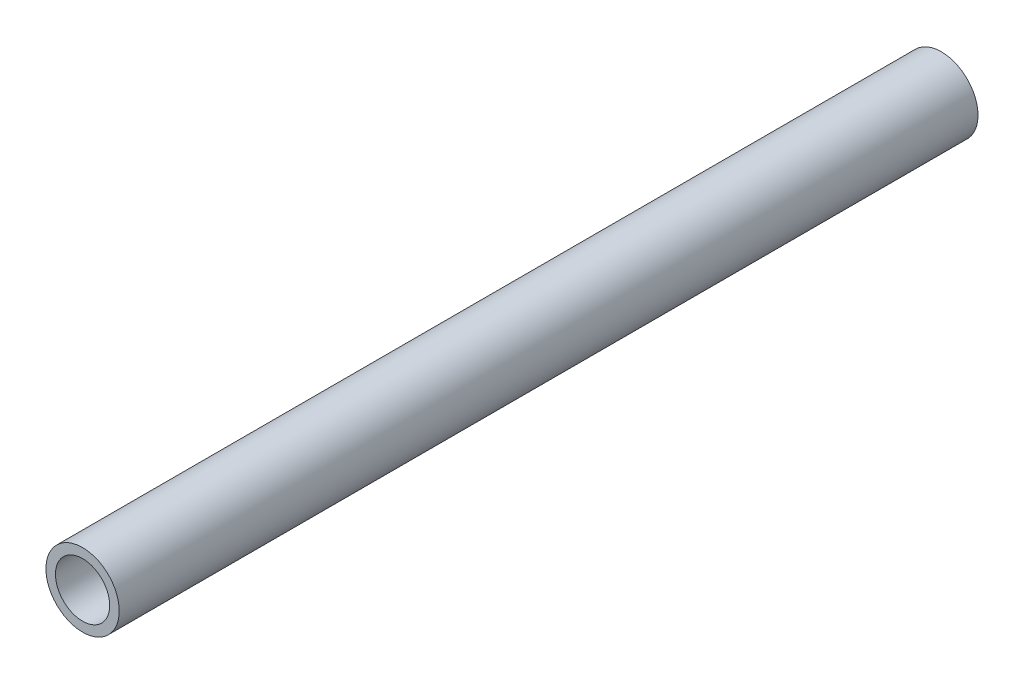
ISO-10303-21;
HEADER;
FILE_DESCRIPTION(('STEP AP214'),'2;1');
FILE_NAME('part.step','',(''),(''),'','','');
FILE_SCHEMA(('AUTOMOTIVE_DESIGN { 1 0 10303 214 1 1 1 1 }'));
ENDSEC;
DATA;
#1=APPLICATION_CONTEXT('core data for automotive mechanical design processes');
#2=APPLICATION_PROTOCOL_DEFINITION('international standard','automotive_design',2000,#1);
#3=PRODUCT_CONTEXT('',#1,'mechanical');
#4=PRODUCT('Part','Part','',(#3));
#5=PRODUCT_RELATED_PRODUCT_CATEGORY('part','',(#4));
#6=PRODUCT_DEFINITION_FORMATION('','',#4);
#7=PRODUCT_DEFINITION_CONTEXT('part definition',#1,'design');
#8=PRODUCT_DEFINITION('design','',#6,#7);
#9=PRODUCT_DEFINITION_SHAPE('','',#8);
#10=(LENGTH_UNIT() NAMED_UNIT(*) SI_UNIT(.MILLI.,.METRE.));
#11=(NAMED_UNIT(*) PLANE_ANGLE_UNIT() SI_UNIT($,.RADIAN.));
#12=(NAMED_UNIT(*) SI_UNIT($,.STERADIAN.) SOLID_ANGLE_UNIT());
#13=UNCERTAINTY_MEASURE_WITH_UNIT(LENGTH_MEASURE(1.E-05),#10,'distance_accuracy_value','');
#14=(GEOMETRIC_REPRESENTATION_CONTEXT(3) GLOBAL_UNCERTAINTY_ASSIGNED_CONTEXT((#13)) GLOBAL_UNIT_ASSIGNED_CONTEXT((#10,
#11,#12)) REPRESENTATION_CONTEXT('',''));
#15=CARTESIAN_POINT('',(0.,0.,0.));
#16=DIRECTION('',(0.,0.,1.));
#17=DIRECTION('',(1.,0.,0.));
#18=AXIS2_PLACEMENT_3D('',#15,#16,#17);
#19=CARTESIAN_POINT('',(0.,0.,125.));
#20=DIRECTION('',(0.,0.,1.));
#21=DIRECTION('',(1.,0.,0.));
#22=AXIS2_PLACEMENT_3D('',#19,#20,#21);
#23=PLANE('',#22);
#24=CARTESIAN_POINT('',(0.,0.,125.));
#25=DIRECTION('',(0.,0.,1.));
#26=DIRECTION('',(1.,0.,0.));
#27=AXIS2_PLACEMENT_3D('',#24,#25,#26);
#28=CIRCLE('',#27,10.668);
#29=CARTESIAN_POINT('',(10.668,0.,125.));
#30=VERTEX_POINT('',#29);
#31=EDGE_CURVE('E11',#30,#30,#28,.T.);
#32=ORIENTED_EDGE('',*,*,#31,.T.);
#33=EDGE_LOOP('',(#32));
#34=FACE_BOUND('',#33,.T.);
#35=CARTESIAN_POINT('',(0.,0.,125.));
#36=DIRECTION('',(0.,0.,1.));
#37=DIRECTION('',(1.,0.,0.));
#38=AXIS2_PLACEMENT_3D('',#35,#36,#37);
#39=CIRCLE('',#38,7.8994);
#40=CARTESIAN_POINT('',(7.8994,0.,125.));
#41=VERTEX_POINT('',#40);
#42=EDGE_CURVE('E56',#41,#41,#39,.T.);
#43=ORIENTED_EDGE('',*,*,#42,.F.);
#44=EDGE_LOOP('',(#43));
#45=FACE_BOUND('',#44,.T.);
#46=ADVANCED_FACE('F43',(#34,#45),#23,.T.);
#47=CARTESIAN_POINT('',(0.,0.,-125.));
#48=DIRECTION('',(0.,0.,1.));
#49=DIRECTION('',(1.,0.,0.));
#50=AXIS2_PLACEMENT_3D('',#47,#48,#49);
#51=PLANE('',#50);
#52=CARTESIAN_POINT('',(0.,0.,-125.));
#53=DIRECTION('',(0.,0.,1.));
#54=DIRECTION('',(1.,0.,0.));
#55=AXIS2_PLACEMENT_3D('',#52,#53,#54);
#56=CIRCLE('',#55,10.668);
#57=CARTESIAN_POINT('',(10.668,0.,-125.));
#58=VERTEX_POINT('',#57);
#59=EDGE_CURVE('E47',#58,#58,#56,.T.);
#60=ORIENTED_EDGE('',*,*,#59,.F.);
#61=EDGE_LOOP('',(#60));
#62=FACE_BOUND('',#61,.T.);
#63=CARTESIAN_POINT('',(0.,0.,-125.));
#64=DIRECTION('',(0.,0.,1.));
#65=DIRECTION('',(1.,0.,0.));
#66=AXIS2_PLACEMENT_3D('',#63,#64,#65);
#67=CIRCLE('',#66,7.8994);
#68=CARTESIAN_POINT('',(7.8994,0.,-125.));
#69=VERTEX_POINT('',#68);
#70=EDGE_CURVE('E58',#69,#69,#67,.T.);
#71=ORIENTED_EDGE('',*,*,#70,.T.);
#72=EDGE_LOOP('',(#71));
#73=FACE_BOUND('',#72,.T.);
#74=ADVANCED_FACE('F70',(#62,#73),#51,.F.);
#75=CARTESIAN_POINT('',(0.,0.,125.));
#76=DIRECTION('',(0.,0.,-1.));
#77=DIRECTION('',(-1.,0.,0.));
#78=AXIS2_PLACEMENT_3D('',#75,#76,#77);
#79=CYLINDRICAL_SURFACE('',#78,10.668);
#80=ORIENTED_EDGE('',*,*,#31,.F.);
#81=EDGE_LOOP('',(#80));
#82=FACE_BOUND('',#81,.T.);
#83=ORIENTED_EDGE('',*,*,#59,.T.);
#84=EDGE_LOOP('',(#83));
#85=FACE_BOUND('',#84,.T.);
#86=ADVANCED_FACE('F45',(#82,#85),#79,.T.);
#87=CARTESIAN_POINT('',(0.,0.,125.));
#88=DIRECTION('',(0.,0.,-1.));
#89=DIRECTION('',(-1.,0.,0.));
#90=AXIS2_PLACEMENT_3D('',#87,#88,#89);
#91=CYLINDRICAL_SURFACE('',#90,7.8994);
#92=ORIENTED_EDGE('',*,*,#42,.T.);
#93=EDGE_LOOP('',(#92));
#94=FACE_BOUND('',#93,.T.);
#95=ORIENTED_EDGE('',*,*,#70,.F.);
#96=EDGE_LOOP('',(#95));
#97=FACE_BOUND('',#96,.T.);
#98=ADVANCED_FACE('F66',(#94,#97),#91,.F.);
#99=CLOSED_SHELL('',(#46,#74,#86,#98));
#100=MANIFOLD_SOLID_BREP('B2',#99);
#101=ADVANCED_BREP_SHAPE_REPRESENTATION('',(#18,#100),#14);
#102=SHAPE_DEFINITION_REPRESENTATION(#9,#101);
ENDSEC;
END-ISO-10303-21;
